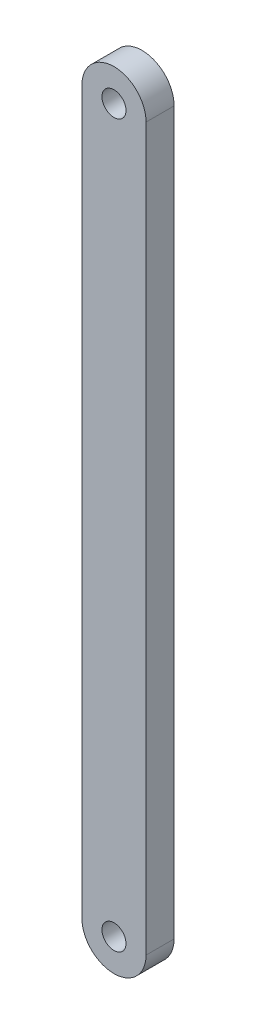
ISO-10303-21;
HEADER;
FILE_DESCRIPTION(('STEP AP214'),'2;1');
FILE_NAME('part.step','',(''),(''),'','','');
FILE_SCHEMA(('AUTOMOTIVE_DESIGN { 1 0 10303 214 1 1 1 1 }'));
ENDSEC;
DATA;
#1=APPLICATION_CONTEXT('core data for automotive mechanical design processes');
#2=APPLICATION_PROTOCOL_DEFINITION('international standard','automotive_design',2000,#1);
#3=PRODUCT_CONTEXT('',#1,'mechanical');
#4=PRODUCT('Part','Part','',(#3));
#5=PRODUCT_RELATED_PRODUCT_CATEGORY('part','',(#4));
#6=PRODUCT_DEFINITION_FORMATION('','',#4);
#7=PRODUCT_DEFINITION_CONTEXT('part definition',#1,'design');
#8=PRODUCT_DEFINITION('design','',#6,#7);
#9=PRODUCT_DEFINITION_SHAPE('','',#8);
#10=(LENGTH_UNIT() NAMED_UNIT(*) SI_UNIT(.MILLI.,.METRE.));
#11=(NAMED_UNIT(*) PLANE_ANGLE_UNIT() SI_UNIT($,.RADIAN.));
#12=(NAMED_UNIT(*) SI_UNIT($,.STERADIAN.) SOLID_ANGLE_UNIT());
#13=UNCERTAINTY_MEASURE_WITH_UNIT(LENGTH_MEASURE(1.E-05),#10,'distance_accuracy_value','');
#14=(GEOMETRIC_REPRESENTATION_CONTEXT(3) GLOBAL_UNCERTAINTY_ASSIGNED_CONTEXT((#13)) GLOBAL_UNIT_ASSIGNED_CONTEXT((#10,
#11,#12)) REPRESENTATION_CONTEXT('',''));
#15=CARTESIAN_POINT('',(0.,0.,0.));
#16=DIRECTION('',(0.,0.,1.));
#17=DIRECTION('',(1.,0.,0.));
#18=AXIS2_PLACEMENT_3D('',#15,#16,#17);
#19=CARTESIAN_POINT('',(0.,90.,3.5));
#20=DIRECTION('',(0.,0.,-1.));
#21=DIRECTION('',(-1.,0.,0.));
#22=AXIS2_PLACEMENT_3D('',#19,#20,#21);
#23=PLANE('',#22);
#24=CARTESIAN_POINT('',(0.,90.,3.5));
#25=DIRECTION('',(0.,0.,1.));
#26=DIRECTION('',(-1.,0.,0.));
#27=AXIS2_PLACEMENT_3D('',#24,#25,#26);
#28=CIRCLE('',#27,4.);
#29=CARTESIAN_POINT('',(4.,90.,3.5));
#30=VERTEX_POINT('',#29);
#31=CARTESIAN_POINT('',(-4.,90.,3.5));
#32=VERTEX_POINT('',#31);
#33=EDGE_CURVE('E86',#30,#32,#28,.T.);
#34=ORIENTED_EDGE('',*,*,#33,.T.);
#35=DIRECTION('',(0.,-1.,0.));
#36=VECTOR('',#35,1.);
#37=CARTESIAN_POINT('',(-4.,90.,3.5));
#38=LINE('',#37,#36);
#39=CARTESIAN_POINT('',(-4.,0.,3.5));
#40=VERTEX_POINT('',#39);
#41=EDGE_CURVE('E81',#32,#40,#38,.T.);
#42=ORIENTED_EDGE('',*,*,#41,.T.);
#43=CARTESIAN_POINT('',(0.,0.,3.5));
#44=DIRECTION('',(0.,0.,1.));
#45=DIRECTION('',(1.,0.,0.));
#46=AXIS2_PLACEMENT_3D('',#43,#44,#45);
#47=CIRCLE('',#46,4.);
#48=CARTESIAN_POINT('',(4.,0.,3.5));
#49=VERTEX_POINT('',#48);
#50=EDGE_CURVE('E84',#40,#49,#47,.T.);
#51=ORIENTED_EDGE('',*,*,#50,.T.);
#52=DIRECTION('',(0.,1.,0.));
#53=VECTOR('',#52,1.);
#54=CARTESIAN_POINT('',(4.,0.,3.5));
#55=LINE('',#54,#53);
#56=EDGE_CURVE('E51',#49,#30,#55,.T.);
#57=ORIENTED_EDGE('',*,*,#56,.T.);
#58=EDGE_LOOP('',(#34,#42,#51,#57));
#59=FACE_BOUND('',#58,.T.);
#60=CARTESIAN_POINT('',(0.,90.,3.5));
#61=DIRECTION('',(0.,0.,1.));
#62=DIRECTION('',(1.,0.,0.));
#63=AXIS2_PLACEMENT_3D('',#60,#61,#62);
#64=CIRCLE('',#63,1.5);
#65=CARTESIAN_POINT('',(1.5,90.,3.5));
#66=VERTEX_POINT('',#65);
#67=EDGE_CURVE('E101',#66,#66,#64,.T.);
#68=ORIENTED_EDGE('',*,*,#67,.F.);
#69=EDGE_LOOP('',(#68));
#70=FACE_BOUND('',#69,.T.);
#71=CARTESIAN_POINT('',(0.,0.,3.5));
#72=DIRECTION('',(0.,0.,1.));
#73=DIRECTION('',(1.,0.,0.));
#74=AXIS2_PLACEMENT_3D('',#71,#72,#73);
#75=CIRCLE('',#74,1.5);
#76=CARTESIAN_POINT('',(1.5,0.,3.5));
#77=VERTEX_POINT('',#76);
#78=EDGE_CURVE('E116',#77,#77,#75,.T.);
#79=ORIENTED_EDGE('',*,*,#78,.F.);
#80=EDGE_LOOP('',(#79));
#81=FACE_BOUND('',#80,.T.);
#82=ADVANCED_FACE('F34',(#59,#70,#81),#23,.F.);
#83=CARTESIAN_POINT('',(0.,90.,0.));
#84=DIRECTION('',(0.,0.,-1.));
#85=DIRECTION('',(-1.,0.,0.));
#86=AXIS2_PLACEMENT_3D('',#83,#84,#85);
#87=PLANE('',#86);
#88=CARTESIAN_POINT('',(0.,90.,0.));
#89=DIRECTION('',(0.,0.,1.));
#90=DIRECTION('',(1.,0.,0.));
#91=AXIS2_PLACEMENT_3D('',#88,#89,#90);
#92=CIRCLE('',#91,1.5);
#93=CARTESIAN_POINT('',(1.5,90.,0.));
#94=VERTEX_POINT('',#93);
#95=EDGE_CURVE('E113',#94,#94,#92,.T.);
#96=ORIENTED_EDGE('',*,*,#95,.T.);
#97=EDGE_LOOP('',(#96));
#98=FACE_BOUND('',#97,.T.);
#99=CARTESIAN_POINT('',(0.,90.,0.));
#100=DIRECTION('',(0.,0.,1.));
#101=DIRECTION('',(-1.,0.,0.));
#102=AXIS2_PLACEMENT_3D('',#99,#100,#101);
#103=CIRCLE('',#102,4.);
#104=CARTESIAN_POINT('',(4.,90.,0.));
#105=VERTEX_POINT('',#104);
#106=CARTESIAN_POINT('',(-4.,90.,0.));
#107=VERTEX_POINT('',#106);
#108=EDGE_CURVE('E98',#105,#107,#103,.T.);
#109=ORIENTED_EDGE('',*,*,#108,.F.);
#110=DIRECTION('',(0.,1.,0.));
#111=VECTOR('',#110,1.);
#112=CARTESIAN_POINT('',(4.,0.,0.));
#113=LINE('',#112,#111);
#114=CARTESIAN_POINT('',(4.,0.,0.));
#115=VERTEX_POINT('',#114);
#116=EDGE_CURVE('E74',#115,#105,#113,.T.);
#117=ORIENTED_EDGE('',*,*,#116,.F.);
#118=CARTESIAN_POINT('',(0.,0.,0.));
#119=DIRECTION('',(0.,0.,1.));
#120=DIRECTION('',(1.,0.,0.));
#121=AXIS2_PLACEMENT_3D('',#118,#119,#120);
#122=CIRCLE('',#121,4.);
#123=CARTESIAN_POINT('',(-4.,0.,0.));
#124=VERTEX_POINT('',#123);
#125=EDGE_CURVE('E68',#124,#115,#122,.T.);
#126=ORIENTED_EDGE('',*,*,#125,.F.);
#127=DIRECTION('',(0.,-1.,0.));
#128=VECTOR('',#127,1.);
#129=CARTESIAN_POINT('',(-4.,90.,0.));
#130=LINE('',#129,#128);
#131=EDGE_CURVE('E90',#107,#124,#130,.T.);
#132=ORIENTED_EDGE('',*,*,#131,.F.);
#133=EDGE_LOOP('',(#109,#117,#126,#132));
#134=FACE_BOUND('',#133,.T.);
#135=CARTESIAN_POINT('',(0.,0.,0.));
#136=DIRECTION('',(0.,0.,1.));
#137=DIRECTION('',(1.,0.,0.));
#138=AXIS2_PLACEMENT_3D('',#135,#136,#137);
#139=CIRCLE('',#138,1.5);
#140=CARTESIAN_POINT('',(1.5,0.,0.));
#141=VERTEX_POINT('',#140);
#142=EDGE_CURVE('E119',#141,#141,#139,.T.);
#143=ORIENTED_EDGE('',*,*,#142,.T.);
#144=EDGE_LOOP('',(#143));
#145=FACE_BOUND('',#144,.T.);
#146=ADVANCED_FACE('F109',(#98,#134,#145),#87,.T.);
#147=CARTESIAN_POINT('',(0.,90.,3.5));
#148=DIRECTION('',(0.,0.,-1.));
#149=DIRECTION('',(-1.,0.,0.));
#150=AXIS2_PLACEMENT_3D('',#147,#148,#149);
#151=CYLINDRICAL_SURFACE('',#150,4.);
#152=ORIENTED_EDGE('',*,*,#108,.T.);
#153=DIRECTION('',(0.,0.,-1.));
#154=VECTOR('',#153,1.);
#155=CARTESIAN_POINT('',(-4.,90.,3.5));
#156=LINE('',#155,#154);
#157=EDGE_CURVE('E11',#32,#107,#156,.T.);
#158=ORIENTED_EDGE('',*,*,#157,.F.);
#159=ORIENTED_EDGE('',*,*,#33,.F.);
#160=DIRECTION('',(0.,0.,-1.));
#161=VECTOR('',#160,1.);
#162=CARTESIAN_POINT('',(4.,90.,3.5));
#163=LINE('',#162,#161);
#164=EDGE_CURVE('E94',#30,#105,#163,.T.);
#165=ORIENTED_EDGE('',*,*,#164,.T.);
#166=EDGE_LOOP('',(#152,#158,#159,#165));
#167=FACE_BOUND('',#166,.T.);
#168=ADVANCED_FACE('F36',(#167),#151,.T.);
#169=CARTESIAN_POINT('',(-4.,90.,3.5));
#170=DIRECTION('',(1.,0.,0.));
#171=DIRECTION('',(0.,0.,-1.));
#172=AXIS2_PLACEMENT_3D('',#169,#170,#171);
#173=PLANE('',#172);
#174=ORIENTED_EDGE('',*,*,#131,.T.);
#175=DIRECTION('',(0.,0.,-1.));
#176=VECTOR('',#175,1.);
#177=CARTESIAN_POINT('',(-4.,0.,3.5));
#178=LINE('',#177,#176);
#179=EDGE_CURVE('E43',#40,#124,#178,.T.);
#180=ORIENTED_EDGE('',*,*,#179,.F.);
#181=ORIENTED_EDGE('',*,*,#41,.F.);
#182=ORIENTED_EDGE('',*,*,#157,.T.);
#183=EDGE_LOOP('',(#174,#180,#181,#182));
#184=FACE_BOUND('',#183,.T.);
#185=ADVANCED_FACE('F89',(#184),#173,.F.);
#186=CARTESIAN_POINT('',(0.,0.,3.5));
#187=DIRECTION('',(0.,0.,-1.));
#188=DIRECTION('',(-1.,0.,0.));
#189=AXIS2_PLACEMENT_3D('',#186,#187,#188);
#190=CYLINDRICAL_SURFACE('',#189,4.);
#191=ORIENTED_EDGE('',*,*,#125,.T.);
#192=DIRECTION('',(0.,0.,-1.));
#193=VECTOR('',#192,1.);
#194=CARTESIAN_POINT('',(4.,0.,3.5));
#195=LINE('',#194,#193);
#196=EDGE_CURVE('E91',#49,#115,#195,.T.);
#197=ORIENTED_EDGE('',*,*,#196,.F.);
#198=ORIENTED_EDGE('',*,*,#50,.F.);
#199=ORIENTED_EDGE('',*,*,#179,.T.);
#200=EDGE_LOOP('',(#191,#197,#198,#199));
#201=FACE_BOUND('',#200,.T.);
#202=ADVANCED_FACE('F92',(#201),#190,.T.);
#203=CARTESIAN_POINT('',(4.,0.,3.5));
#204=DIRECTION('',(-1.,0.,0.));
#205=DIRECTION('',(0.,0.,1.));
#206=AXIS2_PLACEMENT_3D('',#203,#204,#205);
#207=PLANE('',#206);
#208=ORIENTED_EDGE('',*,*,#116,.T.);
#209=ORIENTED_EDGE('',*,*,#164,.F.);
#210=ORIENTED_EDGE('',*,*,#56,.F.);
#211=ORIENTED_EDGE('',*,*,#196,.T.);
#212=EDGE_LOOP('',(#208,#209,#210,#211));
#213=FACE_BOUND('',#212,.T.);
#214=ADVANCED_FACE('F106',(#213),#207,.F.);
#215=CARTESIAN_POINT('',(0.,90.,3.5));
#216=DIRECTION('',(0.,0.,-1.));
#217=DIRECTION('',(-1.,0.,0.));
#218=AXIS2_PLACEMENT_3D('',#215,#216,#217);
#219=CYLINDRICAL_SURFACE('',#218,1.5);
#220=ORIENTED_EDGE('',*,*,#67,.T.);
#221=EDGE_LOOP('',(#220));
#222=FACE_BOUND('',#221,.T.);
#223=ORIENTED_EDGE('',*,*,#95,.F.);
#224=EDGE_LOOP('',(#223));
#225=FACE_BOUND('',#224,.T.);
#226=ADVANCED_FACE('F136',(#222,#225),#219,.F.);
#227=CARTESIAN_POINT('',(0.,0.,3.5));
#228=DIRECTION('',(0.,0.,-1.));
#229=DIRECTION('',(-1.,0.,0.));
#230=AXIS2_PLACEMENT_3D('',#227,#228,#229);
#231=CYLINDRICAL_SURFACE('',#230,1.5);
#232=ORIENTED_EDGE('',*,*,#78,.T.);
#233=EDGE_LOOP('',(#232));
#234=FACE_BOUND('',#233,.T.);
#235=ORIENTED_EDGE('',*,*,#142,.F.);
#236=EDGE_LOOP('',(#235));
#237=FACE_BOUND('',#236,.T.);
#238=ADVANCED_FACE('F125',(#234,#237),#231,.F.);
#239=CLOSED_SHELL('',(#82,#146,#168,#185,#202,#214,#226,#238));
#240=MANIFOLD_SOLID_BREP('B2',#239);
#241=ADVANCED_BREP_SHAPE_REPRESENTATION('',(#18,#240),#14);
#242=SHAPE_DEFINITION_REPRESENTATION(#9,#241);
ENDSEC;
END-ISO-10303-21;
